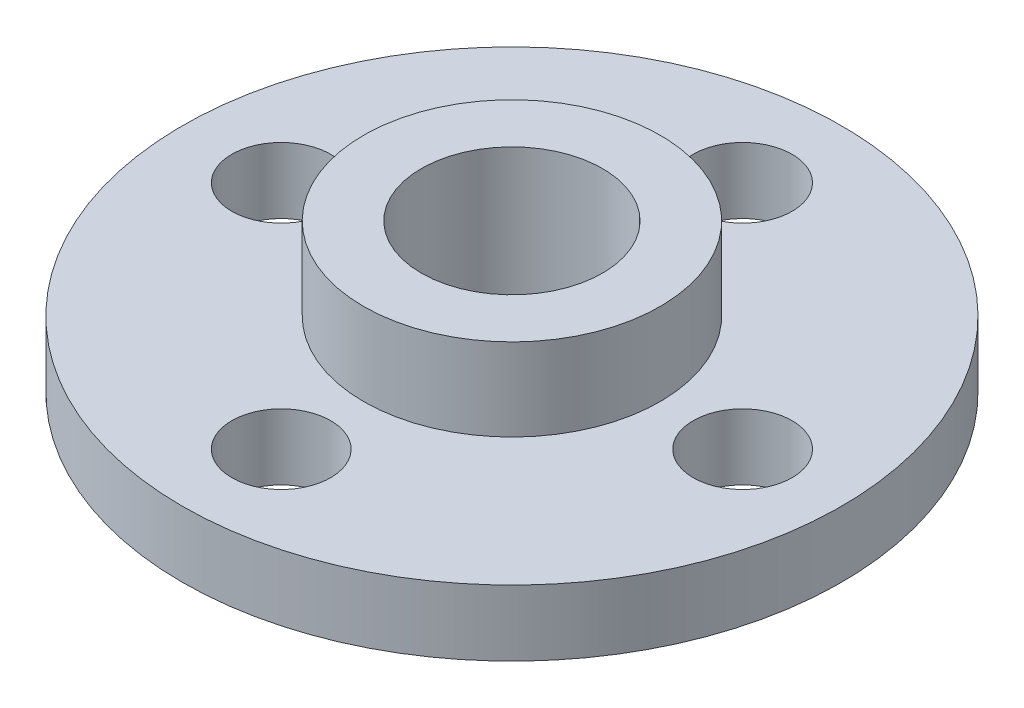
ISO-10303-21;
HEADER;
FILE_DESCRIPTION(('STEP AP214'),'2;1');
FILE_NAME('part.step','',(''),(''),'','','');
FILE_SCHEMA(('AUTOMOTIVE_DESIGN { 1 0 10303 214 1 1 1 1 }'));
ENDSEC;
DATA;
#1=APPLICATION_CONTEXT('core data for automotive mechanical design processes');
#2=APPLICATION_PROTOCOL_DEFINITION('international standard','automotive_design',2000,#1);
#3=PRODUCT_CONTEXT('',#1,'mechanical');
#4=PRODUCT('Part','Part','',(#3));
#5=PRODUCT_RELATED_PRODUCT_CATEGORY('part','',(#4));
#6=PRODUCT_DEFINITION_FORMATION('','',#4);
#7=PRODUCT_DEFINITION_CONTEXT('part definition',#1,'design');
#8=PRODUCT_DEFINITION('design','',#6,#7);
#9=PRODUCT_DEFINITION_SHAPE('','',#8);
#10=(LENGTH_UNIT() NAMED_UNIT(*) SI_UNIT(.MILLI.,.METRE.));
#11=(NAMED_UNIT(*) PLANE_ANGLE_UNIT() SI_UNIT($,.RADIAN.));
#12=(NAMED_UNIT(*) SI_UNIT($,.STERADIAN.) SOLID_ANGLE_UNIT());
#13=UNCERTAINTY_MEASURE_WITH_UNIT(LENGTH_MEASURE(1.E-05),#10,'distance_accuracy_value','');
#14=(GEOMETRIC_REPRESENTATION_CONTEXT(3) GLOBAL_UNCERTAINTY_ASSIGNED_CONTEXT((#13)) GLOBAL_UNIT_ASSIGNED_CONTEXT((#10,
#11,#12)) REPRESENTATION_CONTEXT('',''));
#15=CARTESIAN_POINT('',(0.,0.,0.));
#16=DIRECTION('',(0.,0.,1.));
#17=DIRECTION('',(1.,0.,0.));
#18=AXIS2_PLACEMENT_3D('',#15,#16,#17);
#19=CARTESIAN_POINT('',(7.,2.,0.));
#20=DIRECTION('',(0.,-1.,0.));
#21=DIRECTION('',(0.,0.,-1.));
#22=AXIS2_PLACEMENT_3D('',#19,#20,#21);
#23=CYLINDRICAL_SURFACE('',#22,1.5);
#24=CARTESIAN_POINT('',(7.,2.,0.));
#25=DIRECTION('',(0.,1.,0.));
#26=DIRECTION('',(0.,0.,1.));
#27=AXIS2_PLACEMENT_3D('',#24,#25,#26);
#28=CIRCLE('',#27,1.5);
#29=CARTESIAN_POINT('',(7.,2.,1.5));
#30=VERTEX_POINT('',#29);
#31=EDGE_CURVE('E47',#30,#30,#28,.T.);
#32=ORIENTED_EDGE('',*,*,#31,.T.);
#33=EDGE_LOOP('',(#32));
#34=FACE_BOUND('',#33,.T.);
#35=CARTESIAN_POINT('',(7.,0.,0.));
#36=DIRECTION('',(0.,1.,0.));
#37=DIRECTION('',(0.,0.,1.));
#38=AXIS2_PLACEMENT_3D('',#35,#36,#37);
#39=CIRCLE('',#38,1.5);
#40=CARTESIAN_POINT('',(7.,0.,1.5));
#41=VERTEX_POINT('',#40);
#42=EDGE_CURVE('E65',#41,#41,#39,.T.);
#43=ORIENTED_EDGE('',*,*,#42,.F.);
#44=EDGE_LOOP('',(#43));
#45=FACE_BOUND('',#44,.T.);
#46=ADVANCED_FACE('F39',(#34,#45),#23,.F.);
#47=CARTESIAN_POINT('',(0.,2.,7.));
#48=DIRECTION('',(0.,-1.,0.));
#49=DIRECTION('',(0.,0.,-1.));
#50=AXIS2_PLACEMENT_3D('',#47,#48,#49);
#51=CYLINDRICAL_SURFACE('',#50,1.5);
#52=CARTESIAN_POINT('',(0.,2.,7.));
#53=DIRECTION('',(0.,1.,0.));
#54=DIRECTION('',(0.,0.,1.));
#55=AXIS2_PLACEMENT_3D('',#52,#53,#54);
#56=CIRCLE('',#55,1.5);
#57=CARTESIAN_POINT('',(0.,2.,8.5));
#58=VERTEX_POINT('',#57);
#59=EDGE_CURVE('E52',#58,#58,#56,.T.);
#60=ORIENTED_EDGE('',*,*,#59,.T.);
#61=EDGE_LOOP('',(#60));
#62=FACE_BOUND('',#61,.T.);
#63=CARTESIAN_POINT('',(0.,0.,7.));
#64=DIRECTION('',(0.,1.,0.));
#65=DIRECTION('',(0.,0.,1.));
#66=AXIS2_PLACEMENT_3D('',#63,#64,#65);
#67=CIRCLE('',#66,1.5);
#68=CARTESIAN_POINT('',(0.,0.,8.5));
#69=VERTEX_POINT('',#68);
#70=EDGE_CURVE('E63',#69,#69,#67,.T.);
#71=ORIENTED_EDGE('',*,*,#70,.F.);
#72=EDGE_LOOP('',(#71));
#73=FACE_BOUND('',#72,.T.);
#74=ADVANCED_FACE('F86',(#62,#73),#51,.F.);
#75=CARTESIAN_POINT('',(-7.,2.,0.));
#76=DIRECTION('',(0.,-1.,0.));
#77=DIRECTION('',(0.,0.,-1.));
#78=AXIS2_PLACEMENT_3D('',#75,#76,#77);
#79=CYLINDRICAL_SURFACE('',#78,1.5);
#80=CARTESIAN_POINT('',(-7.,2.,0.));
#81=DIRECTION('',(0.,1.,0.));
#82=DIRECTION('',(0.,0.,1.));
#83=AXIS2_PLACEMENT_3D('',#80,#81,#82);
#84=CIRCLE('',#83,1.5);
#85=CARTESIAN_POINT('',(-7.,2.,1.5));
#86=VERTEX_POINT('',#85);
#87=EDGE_CURVE('E74',#86,#86,#84,.T.);
#88=ORIENTED_EDGE('',*,*,#87,.T.);
#89=EDGE_LOOP('',(#88));
#90=FACE_BOUND('',#89,.T.);
#91=CARTESIAN_POINT('',(-7.,0.,0.));
#92=DIRECTION('',(0.,1.,0.));
#93=DIRECTION('',(0.,0.,1.));
#94=AXIS2_PLACEMENT_3D('',#91,#92,#93);
#95=CIRCLE('',#94,1.5);
#96=CARTESIAN_POINT('',(-7.,0.,1.5));
#97=VERTEX_POINT('',#96);
#98=EDGE_CURVE('E59',#97,#97,#95,.T.);
#99=ORIENTED_EDGE('',*,*,#98,.F.);
#100=EDGE_LOOP('',(#99));
#101=FACE_BOUND('',#100,.T.);
#102=ADVANCED_FACE('F104',(#90,#101),#79,.F.);
#103=CARTESIAN_POINT('',(0.,2.,-7.));
#104=DIRECTION('',(0.,-1.,0.));
#105=DIRECTION('',(0.,0.,-1.));
#106=AXIS2_PLACEMENT_3D('',#103,#104,#105);
#107=CYLINDRICAL_SURFACE('',#106,1.5);
#108=CARTESIAN_POINT('',(0.,2.,-7.));
#109=DIRECTION('',(0.,1.,0.));
#110=DIRECTION('',(0.,0.,1.));
#111=AXIS2_PLACEMENT_3D('',#108,#109,#110);
#112=CIRCLE('',#111,1.5);
#113=CARTESIAN_POINT('',(0.,2.,-5.5));
#114=VERTEX_POINT('',#113);
#115=EDGE_CURVE('E70',#114,#114,#112,.T.);
#116=ORIENTED_EDGE('',*,*,#115,.T.);
#117=EDGE_LOOP('',(#116));
#118=FACE_BOUND('',#117,.T.);
#119=CARTESIAN_POINT('',(0.,0.,-7.));
#120=DIRECTION('',(0.,1.,0.));
#121=DIRECTION('',(0.,0.,1.));
#122=AXIS2_PLACEMENT_3D('',#119,#120,#121);
#123=CIRCLE('',#122,1.5);
#124=CARTESIAN_POINT('',(0.,0.,-5.5));
#125=VERTEX_POINT('',#124);
#126=EDGE_CURVE('E56',#125,#125,#123,.T.);
#127=ORIENTED_EDGE('',*,*,#126,.F.);
#128=EDGE_LOOP('',(#127));
#129=FACE_BOUND('',#128,.T.);
#130=ADVANCED_FACE('F41',(#118,#129),#107,.F.);
#131=CARTESIAN_POINT('',(0.,2.,0.));
#132=DIRECTION('',(0.,-1.,0.));
#133=DIRECTION('',(0.,0.,-1.));
#134=AXIS2_PLACEMENT_3D('',#131,#132,#133);
#135=CYLINDRICAL_SURFACE('',#134,10.);
#136=CARTESIAN_POINT('',(0.,2.,0.));
#137=DIRECTION('',(0.,1.,0.));
#138=DIRECTION('',(0.,0.,1.));
#139=AXIS2_PLACEMENT_3D('',#136,#137,#138);
#140=CIRCLE('',#139,10.);
#141=CARTESIAN_POINT('',(0.,2.,10.));
#142=VERTEX_POINT('',#141);
#143=EDGE_CURVE('E11',#142,#142,#140,.T.);
#144=ORIENTED_EDGE('',*,*,#143,.F.);
#145=EDGE_LOOP('',(#144));
#146=FACE_BOUND('',#145,.T.);
#147=CARTESIAN_POINT('',(0.,0.,0.));
#148=DIRECTION('',(0.,1.,0.));
#149=DIRECTION('',(0.,0.,1.));
#150=AXIS2_PLACEMENT_3D('',#147,#148,#149);
#151=CIRCLE('',#150,10.);
#152=CARTESIAN_POINT('',(0.,0.,10.));
#153=VERTEX_POINT('',#152);
#154=EDGE_CURVE('E43',#153,#153,#151,.T.);
#155=ORIENTED_EDGE('',*,*,#154,.T.);
#156=EDGE_LOOP('',(#155));
#157=FACE_BOUND('',#156,.T.);
#158=ADVANCED_FACE('F93',(#146,#157),#135,.T.);
#159=CARTESIAN_POINT('',(0.,2.,0.));
#160=DIRECTION('',(0.,1.,0.));
#161=DIRECTION('',(0.,0.,1.));
#162=AXIS2_PLACEMENT_3D('',#159,#160,#161);
#163=PLANE('',#162);
#164=CARTESIAN_POINT('',(0.,2.,0.));
#165=DIRECTION('',(0.,1.,0.));
#166=DIRECTION('',(0.,0.,1.));
#167=AXIS2_PLACEMENT_3D('',#164,#165,#166);
#168=CIRCLE('',#167,4.5);
#169=CARTESIAN_POINT('',(0.,2.,4.5));
#170=VERTEX_POINT('',#169);
#171=EDGE_CURVE('E81',#170,#170,#168,.T.);
#172=ORIENTED_EDGE('',*,*,#171,.F.);
#173=EDGE_LOOP('',(#172));
#174=FACE_BOUND('',#173,.T.);
#175=ORIENTED_EDGE('',*,*,#115,.F.);
#176=EDGE_LOOP('',(#175));
#177=FACE_BOUND('',#176,.T.);
#178=ORIENTED_EDGE('',*,*,#87,.F.);
#179=EDGE_LOOP('',(#178));
#180=FACE_BOUND('',#179,.T.);
#181=ORIENTED_EDGE('',*,*,#59,.F.);
#182=EDGE_LOOP('',(#181));
#183=FACE_BOUND('',#182,.T.);
#184=ORIENTED_EDGE('',*,*,#31,.F.);
#185=EDGE_LOOP('',(#184));
#186=FACE_BOUND('',#185,.T.);
#187=ORIENTED_EDGE('',*,*,#143,.T.);
#188=EDGE_LOOP('',(#187));
#189=FACE_BOUND('',#188,.T.);
#190=ADVANCED_FACE('F89',(#174,#177,#180,#183,#186,#189),#163,.T.);
#191=CARTESIAN_POINT('',(0.,0.,0.));
#192=DIRECTION('',(0.,1.,0.));
#193=DIRECTION('',(0.,0.,1.));
#194=AXIS2_PLACEMENT_3D('',#191,#192,#193);
#195=PLANE('',#194);
#196=CARTESIAN_POINT('',(0.,0.,0.));
#197=DIRECTION('',(0.,1.,0.));
#198=DIRECTION('',(0.,0.,1.));
#199=AXIS2_PLACEMENT_3D('',#196,#197,#198);
#200=CIRCLE('',#199,2.75);
#201=CARTESIAN_POINT('',(0.,0.,2.75));
#202=VERTEX_POINT('',#201);
#203=EDGE_CURVE('E145',#202,#202,#200,.T.);
#204=ORIENTED_EDGE('',*,*,#203,.T.);
#205=EDGE_LOOP('',(#204));
#206=FACE_BOUND('',#205,.T.);
#207=ORIENTED_EDGE('',*,*,#126,.T.);
#208=EDGE_LOOP('',(#207));
#209=FACE_BOUND('',#208,.T.);
#210=ORIENTED_EDGE('',*,*,#98,.T.);
#211=EDGE_LOOP('',(#210));
#212=FACE_BOUND('',#211,.T.);
#213=ORIENTED_EDGE('',*,*,#70,.T.);
#214=EDGE_LOOP('',(#213));
#215=FACE_BOUND('',#214,.T.);
#216=ORIENTED_EDGE('',*,*,#42,.T.);
#217=EDGE_LOOP('',(#216));
#218=FACE_BOUND('',#217,.T.);
#219=ORIENTED_EDGE('',*,*,#154,.F.);
#220=EDGE_LOOP('',(#219));
#221=FACE_BOUND('',#220,.T.);
#222=ADVANCED_FACE('F92',(#206,#209,#212,#215,#218,#221),#195,.F.);
#223=CARTESIAN_POINT('',(0.,4.5,0.));
#224=DIRECTION('',(0.,1.,0.));
#225=DIRECTION('',(0.,0.,1.));
#226=AXIS2_PLACEMENT_3D('',#223,#224,#225);
#227=PLANE('',#226);
#228=CARTESIAN_POINT('',(0.,4.5,0.));
#229=DIRECTION('',(0.,1.,0.));
#230=DIRECTION('',(0.,0.,1.));
#231=AXIS2_PLACEMENT_3D('',#228,#229,#230);
#232=CIRCLE('',#231,4.5);
#233=CARTESIAN_POINT('',(0.,4.5,4.5));
#234=VERTEX_POINT('',#233);
#235=EDGE_CURVE('E60',#234,#234,#232,.T.);
#236=ORIENTED_EDGE('',*,*,#235,.T.);
#237=EDGE_LOOP('',(#236));
#238=FACE_BOUND('',#237,.T.);
#239=CARTESIAN_POINT('',(0.,4.5,0.));
#240=DIRECTION('',(0.,1.,0.));
#241=DIRECTION('',(0.,0.,1.));
#242=AXIS2_PLACEMENT_3D('',#239,#240,#241);
#243=CIRCLE('',#242,2.75);
#244=CARTESIAN_POINT('',(0.,4.5,2.75));
#245=VERTEX_POINT('',#244);
#246=EDGE_CURVE('E143',#245,#245,#243,.T.);
#247=ORIENTED_EDGE('',*,*,#246,.F.);
#248=EDGE_LOOP('',(#247));
#249=FACE_BOUND('',#248,.T.);
#250=ADVANCED_FACE('F119',(#238,#249),#227,.T.);
#251=CARTESIAN_POINT('',(0.,4.5,0.));
#252=DIRECTION('',(0.,-1.,0.));
#253=DIRECTION('',(0.,0.,-1.));
#254=AXIS2_PLACEMENT_3D('',#251,#252,#253);
#255=CYLINDRICAL_SURFACE('',#254,4.5);
#256=ORIENTED_EDGE('',*,*,#235,.F.);
#257=EDGE_LOOP('',(#256));
#258=FACE_BOUND('',#257,.T.);
#259=ORIENTED_EDGE('',*,*,#171,.T.);
#260=EDGE_LOOP('',(#259));
#261=FACE_BOUND('',#260,.T.);
#262=ADVANCED_FACE('F126',(#258,#261),#255,.T.);
#263=CARTESIAN_POINT('',(0.,4.5,0.));
#264=DIRECTION('',(0.,-1.,0.));
#265=DIRECTION('',(0.,0.,-1.));
#266=AXIS2_PLACEMENT_3D('',#263,#264,#265);
#267=CYLINDRICAL_SURFACE('',#266,2.75);
#268=ORIENTED_EDGE('',*,*,#246,.T.);
#269=EDGE_LOOP('',(#268));
#270=FACE_BOUND('',#269,.T.);
#271=ORIENTED_EDGE('',*,*,#203,.F.);
#272=EDGE_LOOP('',(#271));
#273=FACE_BOUND('',#272,.T.);
#274=ADVANCED_FACE('F133',(#270,#273),#267,.F.);
#275=CLOSED_SHELL('',(#46,#74,#102,#130,#158,#190,#222,#250,#262,#274));
#276=MANIFOLD_SOLID_BREP('B2',#275);
#277=ADVANCED_BREP_SHAPE_REPRESENTATION('',(#18,#276),#14);
#278=SHAPE_DEFINITION_REPRESENTATION(#9,#277);
ENDSEC;
END-ISO-10303-21;
